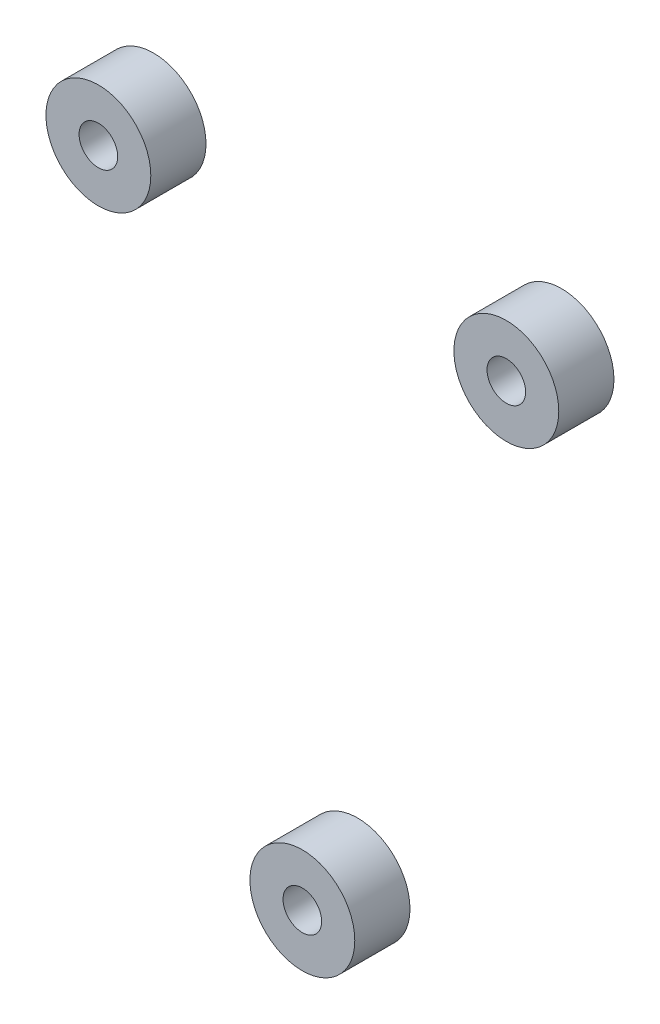
ISO-10303-21;
HEADER;
FILE_DESCRIPTION(('STEP AP214'),'2;1');
FILE_NAME('part.step','',(''),(''),'','','');
FILE_SCHEMA(('AUTOMOTIVE_DESIGN { 1 0 10303 214 1 1 1 1 }'));
ENDSEC;
DATA;
#1=APPLICATION_CONTEXT('core data for automotive mechanical design processes');
#2=APPLICATION_PROTOCOL_DEFINITION('international standard','automotive_design',2000,#1);
#3=PRODUCT_CONTEXT('',#1,'mechanical');
#4=PRODUCT('Part','Part','',(#3));
#5=PRODUCT_RELATED_PRODUCT_CATEGORY('part','',(#4));
#6=PRODUCT_DEFINITION_FORMATION('','',#4);
#7=PRODUCT_DEFINITION_CONTEXT('part definition',#1,'design');
#8=PRODUCT_DEFINITION('design','',#6,#7);
#9=PRODUCT_DEFINITION_SHAPE('','',#8);
#10=(LENGTH_UNIT() NAMED_UNIT(*) SI_UNIT(.MILLI.,.METRE.));
#11=(NAMED_UNIT(*) PLANE_ANGLE_UNIT() SI_UNIT($,.RADIAN.));
#12=(NAMED_UNIT(*) SI_UNIT($,.STERADIAN.) SOLID_ANGLE_UNIT());
#13=UNCERTAINTY_MEASURE_WITH_UNIT(LENGTH_MEASURE(1.E-05),#10,'distance_accuracy_value','');
#14=(GEOMETRIC_REPRESENTATION_CONTEXT(3) GLOBAL_UNCERTAINTY_ASSIGNED_CONTEXT((#13)) GLOBAL_UNIT_ASSIGNED_CONTEXT((#10,
#11,#12)) REPRESENTATION_CONTEXT('',''));
#15=CARTESIAN_POINT('',(0.,0.,0.));
#16=DIRECTION('',(0.,0.,1.));
#17=DIRECTION('',(1.,0.,0.));
#18=AXIS2_PLACEMENT_3D('',#15,#16,#17);
#19=CARTESIAN_POINT('',(0.,-57.5,10.));
#20=DIRECTION('',(0.,0.,1.));
#21=DIRECTION('',(1.,0.,0.));
#22=AXIS2_PLACEMENT_3D('',#19,#20,#21);
#23=PLANE('',#22);
#24=CARTESIAN_POINT('',(0.,-57.5,10.));
#25=DIRECTION('',(0.,0.,1.));
#26=DIRECTION('',(1.,0.,0.));
#27=AXIS2_PLACEMENT_3D('',#24,#25,#26);
#28=CIRCLE('',#27,9.5);
#29=CARTESIAN_POINT('',(9.5,-57.5,10.));
#30=VERTEX_POINT('',#29);
#31=EDGE_CURVE('E11',#30,#30,#28,.T.);
#32=ORIENTED_EDGE('',*,*,#31,.T.);
#33=EDGE_LOOP('',(#32));
#34=FACE_BOUND('',#33,.T.);
#35=CARTESIAN_POINT('',(0.,-57.5,10.));
#36=DIRECTION('',(0.,0.,1.));
#37=DIRECTION('',(1.,0.,0.));
#38=AXIS2_PLACEMENT_3D('',#35,#36,#37);
#39=CIRCLE('',#38,3.5);
#40=CARTESIAN_POINT('',(3.5,-57.5,10.));
#41=VERTEX_POINT('',#40);
#42=EDGE_CURVE('E56',#41,#41,#39,.T.);
#43=ORIENTED_EDGE('',*,*,#42,.F.);
#44=EDGE_LOOP('',(#43));
#45=FACE_BOUND('',#44,.T.);
#46=ADVANCED_FACE('F45',(#34,#45),#23,.T.);
#47=CARTESIAN_POINT('',(0.,-57.5,0.));
#48=DIRECTION('',(0.,0.,1.));
#49=DIRECTION('',(1.,0.,0.));
#50=AXIS2_PLACEMENT_3D('',#47,#48,#49);
#51=PLANE('',#50);
#52=CARTESIAN_POINT('',(0.,-57.5,0.));
#53=DIRECTION('',(0.,0.,1.));
#54=DIRECTION('',(1.,0.,0.));
#55=AXIS2_PLACEMENT_3D('',#52,#53,#54);
#56=CIRCLE('',#55,9.5);
#57=CARTESIAN_POINT('',(9.5,-57.5,0.));
#58=VERTEX_POINT('',#57);
#59=EDGE_CURVE('E49',#58,#58,#56,.T.);
#60=ORIENTED_EDGE('',*,*,#59,.F.);
#61=EDGE_LOOP('',(#60));
#62=FACE_BOUND('',#61,.T.);
#63=CARTESIAN_POINT('',(0.,-57.5,0.));
#64=DIRECTION('',(0.,0.,1.));
#65=DIRECTION('',(1.,0.,0.));
#66=AXIS2_PLACEMENT_3D('',#63,#64,#65);
#67=CIRCLE('',#66,3.5);
#68=CARTESIAN_POINT('',(3.5,-57.5,0.));
#69=VERTEX_POINT('',#68);
#70=EDGE_CURVE('E58',#69,#69,#67,.T.);
#71=ORIENTED_EDGE('',*,*,#70,.T.);
#72=EDGE_LOOP('',(#71));
#73=FACE_BOUND('',#72,.T.);
#74=ADVANCED_FACE('F68',(#62,#73),#51,.F.);
#75=CARTESIAN_POINT('',(0.,-57.5,10.));
#76=DIRECTION('',(0.,0.,-1.));
#77=DIRECTION('',(-1.,0.,0.));
#78=AXIS2_PLACEMENT_3D('',#75,#76,#77);
#79=CYLINDRICAL_SURFACE('',#78,9.5);
#80=ORIENTED_EDGE('',*,*,#31,.F.);
#81=EDGE_LOOP('',(#80));
#82=FACE_BOUND('',#81,.T.);
#83=ORIENTED_EDGE('',*,*,#59,.T.);
#84=EDGE_LOOP('',(#83));
#85=FACE_BOUND('',#84,.T.);
#86=ADVANCED_FACE('F47',(#82,#85),#79,.T.);
#87=CARTESIAN_POINT('',(0.,-57.5,10.));
#88=DIRECTION('',(0.,0.,-1.));
#89=DIRECTION('',(-1.,0.,0.));
#90=AXIS2_PLACEMENT_3D('',#87,#88,#89);
#91=CYLINDRICAL_SURFACE('',#90,3.5);
#92=ORIENTED_EDGE('',*,*,#42,.T.);
#93=EDGE_LOOP('',(#92));
#94=FACE_BOUND('',#93,.T.);
#95=ORIENTED_EDGE('',*,*,#70,.F.);
#96=EDGE_LOOP('',(#95));
#97=FACE_BOUND('',#96,.T.);
#98=ADVANCED_FACE('F64',(#94,#97),#91,.F.);
#99=CLOSED_SHELL('',(#46,#74,#86,#98));
#100=MANIFOLD_SOLID_BREP('B2',#99);
#101=CARTESIAN_POINT('',(36.9602875569758,44.0475554793414,10.));
#102=DIRECTION('',(0.,0.,1.));
#103=DIRECTION('',(1.,0.,0.));
#104=AXIS2_PLACEMENT_3D('',#101,#102,#103);
#105=PLANE('',#104);
#106=CARTESIAN_POINT('',(36.9602875569758,44.0475554793414,10.));
#107=DIRECTION('',(0.,0.,1.));
#108=DIRECTION('',(1.,0.,0.));
#109=AXIS2_PLACEMENT_3D('',#106,#107,#108);
#110=CIRCLE('',#109,9.5);
#111=CARTESIAN_POINT('',(46.4602875569758,44.0475554793414,10.));
#112=VERTEX_POINT('',#111);
#113=EDGE_CURVE('E44',#112,#112,#110,.T.);
#114=ORIENTED_EDGE('',*,*,#113,.T.);
#115=EDGE_LOOP('',(#114));
#116=FACE_BOUND('',#115,.T.);
#117=CARTESIAN_POINT('',(36.9602875569758,44.0475554793414,10.));
#118=DIRECTION('',(0.,0.,1.));
#119=DIRECTION('',(1.,0.,0.));
#120=AXIS2_PLACEMENT_3D('',#117,#118,#119);
#121=CIRCLE('',#120,3.5);
#122=CARTESIAN_POINT('',(40.4602875569758,44.0475554793414,10.));
#123=VERTEX_POINT('',#122);
#124=EDGE_CURVE('E126',#123,#123,#121,.T.);
#125=ORIENTED_EDGE('',*,*,#124,.F.);
#126=EDGE_LOOP('',(#125));
#127=FACE_BOUND('',#126,.T.);
#128=ADVANCED_FACE('F113',(#116,#127),#105,.T.);
#129=CARTESIAN_POINT('',(36.9602875569758,44.0475554793414,0.));
#130=DIRECTION('',(0.,0.,1.));
#131=DIRECTION('',(1.,0.,0.));
#132=AXIS2_PLACEMENT_3D('',#129,#130,#131);
#133=PLANE('',#132);
#134=CARTESIAN_POINT('',(36.9602875569758,44.0475554793414,0.));
#135=DIRECTION('',(0.,0.,1.));
#136=DIRECTION('',(1.,0.,0.));
#137=AXIS2_PLACEMENT_3D('',#134,#135,#136);
#138=CIRCLE('',#137,9.5);
#139=CARTESIAN_POINT('',(46.4602875569758,44.0475554793414,0.));
#140=VERTEX_POINT('',#139);
#141=EDGE_CURVE('E117',#140,#140,#138,.T.);
#142=ORIENTED_EDGE('',*,*,#141,.F.);
#143=EDGE_LOOP('',(#142));
#144=FACE_BOUND('',#143,.T.);
#145=CARTESIAN_POINT('',(36.9602875569758,44.0475554793414,0.));
#146=DIRECTION('',(0.,0.,1.));
#147=DIRECTION('',(1.,0.,0.));
#148=AXIS2_PLACEMENT_3D('',#145,#146,#147);
#149=CIRCLE('',#148,3.5);
#150=CARTESIAN_POINT('',(40.4602875569758,44.0475554793414,0.));
#151=VERTEX_POINT('',#150);
#152=EDGE_CURVE('E128',#151,#151,#149,.T.);
#153=ORIENTED_EDGE('',*,*,#152,.T.);
#154=EDGE_LOOP('',(#153));
#155=FACE_BOUND('',#154,.T.);
#156=ADVANCED_FACE('F140',(#144,#155),#133,.F.);
#157=CARTESIAN_POINT('',(36.9602875569758,44.0475554793414,10.));
#158=DIRECTION('',(0.,0.,-1.));
#159=DIRECTION('',(-1.,0.,0.));
#160=AXIS2_PLACEMENT_3D('',#157,#158,#159);
#161=CYLINDRICAL_SURFACE('',#160,9.5);
#162=ORIENTED_EDGE('',*,*,#113,.F.);
#163=EDGE_LOOP('',(#162));
#164=FACE_BOUND('',#163,.T.);
#165=ORIENTED_EDGE('',*,*,#141,.T.);
#166=EDGE_LOOP('',(#165));
#167=FACE_BOUND('',#166,.T.);
#168=ADVANCED_FACE('F115',(#164,#167),#161,.T.);
#169=CARTESIAN_POINT('',(36.9602875569758,44.0475554793414,10.));
#170=DIRECTION('',(0.,0.,-1.));
#171=DIRECTION('',(-1.,0.,0.));
#172=AXIS2_PLACEMENT_3D('',#169,#170,#171);
#173=CYLINDRICAL_SURFACE('',#172,3.5);
#174=ORIENTED_EDGE('',*,*,#124,.T.);
#175=EDGE_LOOP('',(#174));
#176=FACE_BOUND('',#175,.T.);
#177=ORIENTED_EDGE('',*,*,#152,.F.);
#178=EDGE_LOOP('',(#177));
#179=FACE_BOUND('',#178,.T.);
#180=ADVANCED_FACE('F136',(#176,#179),#173,.F.);
#181=CLOSED_SHELL('',(#128,#156,#168,#180));
#182=MANIFOLD_SOLID_BREP('B6',#181);
#183=CARTESIAN_POINT('',(-36.9602875569758,44.0475554793414,10.));
#184=DIRECTION('',(0.,0.,1.));
#185=DIRECTION('',(1.,0.,0.));
#186=AXIS2_PLACEMENT_3D('',#183,#184,#185);
#187=PLANE('',#186);
#188=CARTESIAN_POINT('',(-36.9602875569758,44.0475554793414,10.));
#189=DIRECTION('',(0.,0.,1.));
#190=DIRECTION('',(1.,0.,0.));
#191=AXIS2_PLACEMENT_3D('',#188,#189,#190);
#192=CIRCLE('',#191,9.5);
#193=CARTESIAN_POINT('',(-27.4602875569758,44.0475554793414,10.));
#194=VERTEX_POINT('',#193);
#195=EDGE_CURVE('E112',#194,#194,#192,.T.);
#196=ORIENTED_EDGE('',*,*,#195,.T.);
#197=EDGE_LOOP('',(#196));
#198=FACE_BOUND('',#197,.T.);
#199=CARTESIAN_POINT('',(-36.9602875569758,44.0475554793414,10.));
#200=DIRECTION('',(0.,0.,1.));
#201=DIRECTION('',(1.,0.,0.));
#202=AXIS2_PLACEMENT_3D('',#199,#200,#201);
#203=CIRCLE('',#202,3.5);
#204=CARTESIAN_POINT('',(-33.4602875569758,44.0475554793414,10.));
#205=VERTEX_POINT('',#204);
#206=EDGE_CURVE('E189',#205,#205,#203,.T.);
#207=ORIENTED_EDGE('',*,*,#206,.F.);
#208=EDGE_LOOP('',(#207));
#209=FACE_BOUND('',#208,.T.);
#210=ADVANCED_FACE('F178',(#198,#209),#187,.T.);
#211=CARTESIAN_POINT('',(-36.9602875569758,44.0475554793414,0.));
#212=DIRECTION('',(0.,0.,1.));
#213=DIRECTION('',(1.,0.,0.));
#214=AXIS2_PLACEMENT_3D('',#211,#212,#213);
#215=PLANE('',#214);
#216=CARTESIAN_POINT('',(-36.9602875569758,44.0475554793414,0.));
#217=DIRECTION('',(0.,0.,1.));
#218=DIRECTION('',(1.,0.,0.));
#219=AXIS2_PLACEMENT_3D('',#216,#217,#218);
#220=CIRCLE('',#219,9.5);
#221=CARTESIAN_POINT('',(-27.4602875569758,44.0475554793414,0.));
#222=VERTEX_POINT('',#221);
#223=EDGE_CURVE('E182',#222,#222,#220,.T.);
#224=ORIENTED_EDGE('',*,*,#223,.F.);
#225=EDGE_LOOP('',(#224));
#226=FACE_BOUND('',#225,.T.);
#227=CARTESIAN_POINT('',(-36.9602875569758,44.0475554793414,0.));
#228=DIRECTION('',(0.,0.,1.));
#229=DIRECTION('',(1.,0.,0.));
#230=AXIS2_PLACEMENT_3D('',#227,#228,#229);
#231=CIRCLE('',#230,3.5);
#232=CARTESIAN_POINT('',(-33.4602875569758,44.0475554793414,0.));
#233=VERTEX_POINT('',#232);
#234=EDGE_CURVE('E191',#233,#233,#231,.T.);
#235=ORIENTED_EDGE('',*,*,#234,.T.);
#236=EDGE_LOOP('',(#235));
#237=FACE_BOUND('',#236,.T.);
#238=ADVANCED_FACE('F201',(#226,#237),#215,.F.);
#239=CARTESIAN_POINT('',(-36.9602875569758,44.0475554793414,10.));
#240=DIRECTION('',(0.,0.,-1.));
#241=DIRECTION('',(-1.,0.,0.));
#242=AXIS2_PLACEMENT_3D('',#239,#240,#241);
#243=CYLINDRICAL_SURFACE('',#242,9.5);
#244=ORIENTED_EDGE('',*,*,#195,.F.);
#245=EDGE_LOOP('',(#244));
#246=FACE_BOUND('',#245,.T.);
#247=ORIENTED_EDGE('',*,*,#223,.T.);
#248=EDGE_LOOP('',(#247));
#249=FACE_BOUND('',#248,.T.);
#250=ADVANCED_FACE('F180',(#246,#249),#243,.T.);
#251=CARTESIAN_POINT('',(-36.9602875569758,44.0475554793414,10.));
#252=DIRECTION('',(0.,0.,-1.));
#253=DIRECTION('',(-1.,0.,0.));
#254=AXIS2_PLACEMENT_3D('',#251,#252,#253);
#255=CYLINDRICAL_SURFACE('',#254,3.5);
#256=ORIENTED_EDGE('',*,*,#206,.T.);
#257=EDGE_LOOP('',(#256));
#258=FACE_BOUND('',#257,.T.);
#259=ORIENTED_EDGE('',*,*,#234,.F.);
#260=EDGE_LOOP('',(#259));
#261=FACE_BOUND('',#260,.T.);
#262=ADVANCED_FACE('F197',(#258,#261),#255,.F.);
#263=CLOSED_SHELL('',(#210,#238,#250,#262));
#264=MANIFOLD_SOLID_BREP('B39',#263);
#265=ADVANCED_BREP_SHAPE_REPRESENTATION('',(#18,#100,#182,#264),#14);
#266=SHAPE_DEFINITION_REPRESENTATION(#9,#265);
ENDSEC;
END-ISO-10303-21;
